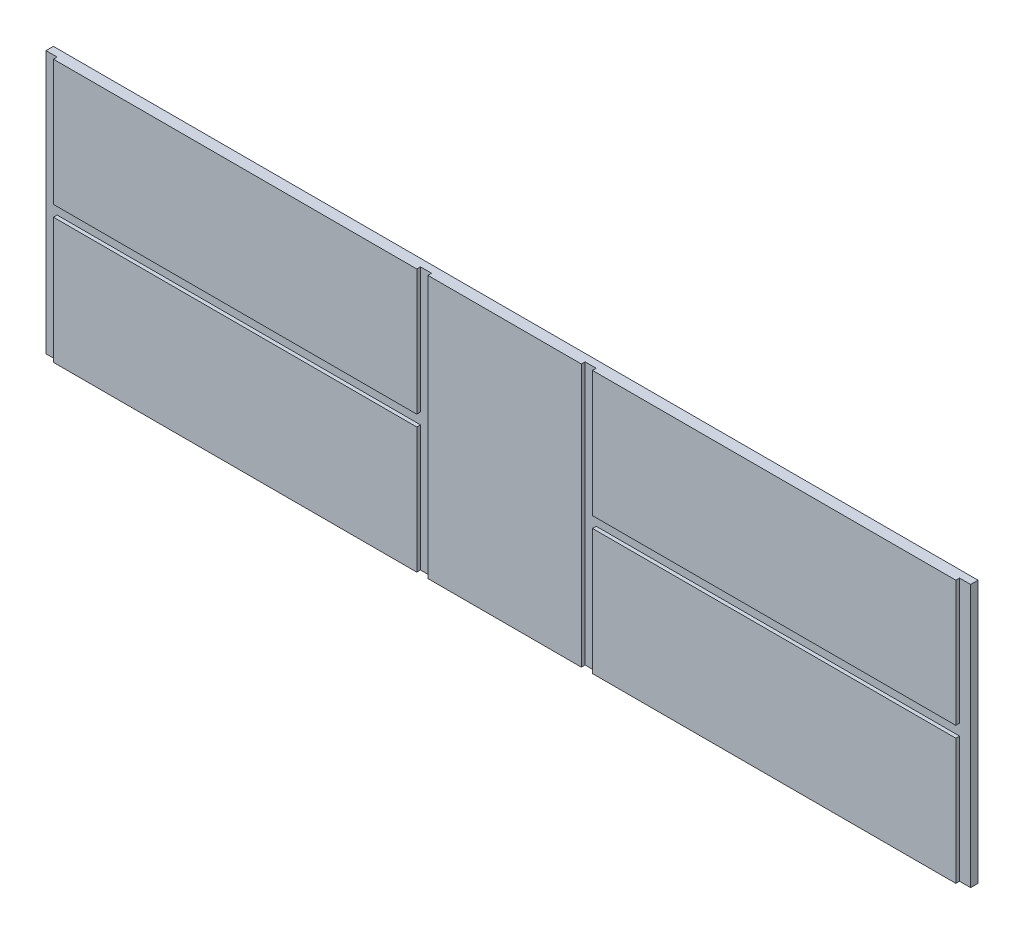
ISO-10303-21;
HEADER;
FILE_DESCRIPTION(('STEP AP214'),'2;1');
FILE_NAME('part.step','',(''),(''),'','','');
FILE_SCHEMA(('AUTOMOTIVE_DESIGN { 1 0 10303 214 1 1 1 1 }'));
ENDSEC;
DATA;
#1=APPLICATION_CONTEXT('core data for automotive mechanical design processes');
#2=APPLICATION_PROTOCOL_DEFINITION('international standard','automotive_design',2000,#1);
#3=PRODUCT_CONTEXT('',#1,'mechanical');
#4=PRODUCT('Part','Part','',(#3));
#5=PRODUCT_RELATED_PRODUCT_CATEGORY('part','',(#4));
#6=PRODUCT_DEFINITION_FORMATION('','',#4);
#7=PRODUCT_DEFINITION_CONTEXT('part definition',#1,'design');
#8=PRODUCT_DEFINITION('design','',#6,#7);
#9=PRODUCT_DEFINITION_SHAPE('','',#8);
#10=(LENGTH_UNIT() NAMED_UNIT(*) SI_UNIT(.MILLI.,.METRE.));
#11=(NAMED_UNIT(*) PLANE_ANGLE_UNIT() SI_UNIT($,.RADIAN.));
#12=(NAMED_UNIT(*) SI_UNIT($,.STERADIAN.) SOLID_ANGLE_UNIT());
#13=UNCERTAINTY_MEASURE_WITH_UNIT(LENGTH_MEASURE(1.E-05),#10,'distance_accuracy_value','');
#14=(GEOMETRIC_REPRESENTATION_CONTEXT(3) GLOBAL_UNCERTAINTY_ASSIGNED_CONTEXT((#13)) GLOBAL_UNIT_ASSIGNED_CONTEXT((#10,
#11,#12)) REPRESENTATION_CONTEXT('',''));
#15=CARTESIAN_POINT('',(0.,0.,0.));
#16=DIRECTION('',(0.,0.,1.));
#17=DIRECTION('',(1.,0.,0.));
#18=AXIS2_PLACEMENT_3D('',#15,#16,#17);
#19=CARTESIAN_POINT('',(0.,0.,12.));
#20=DIRECTION('',(0.,0.,1.));
#21=DIRECTION('',(1.,0.,0.));
#22=AXIS2_PLACEMENT_3D('',#19,#20,#21);
#23=PLANE('',#22);
#24=DIRECTION('',(-1.,0.,0.));
#25=VECTOR('',#24,1.);
#26=CARTESIAN_POINT('',(12.,148.,12.));
#27=LINE('',#26,#25);
#28=CARTESIAN_POINT('',(405.,148.,12.));
#29=VERTEX_POINT('',#28);
#30=CARTESIAN_POINT('',(12.,148.,12.));
#31=VERTEX_POINT('',#30);
#32=EDGE_CURVE('E201',#29,#31,#27,.T.);
#33=ORIENTED_EDGE('',*,*,#32,.F.);
#34=DIRECTION('',(0.,-1.,0.));
#35=VECTOR('',#34,1.);
#36=CARTESIAN_POINT('',(405.,284.,12.));
#37=LINE('',#36,#35);
#38=CARTESIAN_POINT('',(405.,284.,12.));
#39=VERTEX_POINT('',#38);
#40=EDGE_CURVE('E294',#39,#29,#37,.T.);
#41=ORIENTED_EDGE('',*,*,#40,.F.);
#42=DIRECTION('',(1.,0.,0.));
#43=VECTOR('',#42,1.);
#44=CARTESIAN_POINT('',(0.,284.,12.));
#45=LINE('',#44,#43);
#46=CARTESIAN_POINT('',(12.,284.,12.));
#47=VERTEX_POINT('',#46);
#48=EDGE_CURVE('E318',#47,#39,#45,.T.);
#49=ORIENTED_EDGE('',*,*,#48,.F.);
#50=DIRECTION('',(0.,1.,0.));
#51=VECTOR('',#50,1.);
#52=CARTESIAN_POINT('',(12.,284.,12.));
#53=LINE('',#52,#51);
#54=EDGE_CURVE('E225',#31,#47,#53,.T.);
#55=ORIENTED_EDGE('',*,*,#54,.F.);
#56=EDGE_LOOP('',(#33,#41,#49,#55));
#57=FACE_BOUND('',#56,.T.);
#58=ADVANCED_FACE('F33',(#57),#23,.T.);
#59=DIRECTION('',(-1.,0.,0.));
#60=VECTOR('',#59,1.);
#61=CARTESIAN_POINT('',(595.,148.,12.));
#62=LINE('',#61,#60);
#63=CARTESIAN_POINT('',(988.,148.,12.));
#64=VERTEX_POINT('',#63);
#65=CARTESIAN_POINT('',(595.,148.,12.));
#66=VERTEX_POINT('',#65);
#67=EDGE_CURVE('E395',#64,#66,#62,.T.);
#68=ORIENTED_EDGE('',*,*,#67,.F.);
#69=DIRECTION('',(0.,-1.,0.));
#70=VECTOR('',#69,1.);
#71=CARTESIAN_POINT('',(988.,284.,12.));
#72=LINE('',#71,#70);
#73=CARTESIAN_POINT('',(988.,284.,12.));
#74=VERTEX_POINT('',#73);
#75=EDGE_CURVE('E265',#74,#64,#72,.T.);
#76=ORIENTED_EDGE('',*,*,#75,.F.);
#77=CARTESIAN_POINT('',(595.,284.,12.));
#78=VERTEX_POINT('',#77);
#79=EDGE_CURVE('E314',#78,#74,#45,.T.);
#80=ORIENTED_EDGE('',*,*,#79,.F.);
#81=DIRECTION('',(0.,1.,0.));
#82=VECTOR('',#81,1.);
#83=CARTESIAN_POINT('',(595.,284.,12.));
#84=LINE('',#83,#82);
#85=EDGE_CURVE('E248',#66,#78,#84,.T.);
#86=ORIENTED_EDGE('',*,*,#85,.F.);
#87=EDGE_LOOP('',(#68,#76,#80,#86));
#88=FACE_BOUND('',#87,.T.);
#89=ADVANCED_FACE('F394',(#88),#23,.T.);
#90=CARTESIAN_POINT('',(988.,284.,8.));
#91=DIRECTION('',(-1.,0.,0.));
#92=DIRECTION('',(0.,0.,1.));
#93=AXIS2_PLACEMENT_3D('',#90,#91,#92);
#94=PLANE('',#93);
#95=ORIENTED_EDGE('',*,*,#75,.T.);
#96=DIRECTION('',(0.,0.,1.));
#97=VECTOR('',#96,1.);
#98=CARTESIAN_POINT('',(988.,148.,8.));
#99=LINE('',#98,#97);
#100=CARTESIAN_POINT('',(988.,148.,8.));
#101=VERTEX_POINT('',#100);
#102=EDGE_CURVE('E399',#101,#64,#99,.T.);
#103=ORIENTED_EDGE('',*,*,#102,.F.);
#104=DIRECTION('',(0.,-1.,0.));
#105=VECTOR('',#104,1.);
#106=CARTESIAN_POINT('',(988.,284.,8.));
#107=LINE('',#106,#105);
#108=CARTESIAN_POINT('',(988.,284.,8.));
#109=VERTEX_POINT('',#108);
#110=EDGE_CURVE('E269',#109,#101,#107,.T.);
#111=ORIENTED_EDGE('',*,*,#110,.F.);
#112=DIRECTION('',(0.,0.,1.));
#113=VECTOR('',#112,1.);
#114=CARTESIAN_POINT('',(988.,284.,8.));
#115=LINE('',#114,#113);
#116=EDGE_CURVE('E273',#109,#74,#115,.T.);
#117=ORIENTED_EDGE('',*,*,#116,.T.);
#118=EDGE_LOOP('',(#95,#103,#111,#117));
#119=FACE_BOUND('',#118,.T.);
#120=ADVANCED_FACE('F398',(#119),#94,.F.);
#121=CARTESIAN_POINT('',(405.,284.,8.));
#122=DIRECTION('',(-1.,0.,0.));
#123=DIRECTION('',(0.,-1.,0.));
#124=AXIS2_PLACEMENT_3D('',#121,#122,#123);
#125=PLANE('',#124);
#126=ORIENTED_EDGE('',*,*,#40,.T.);
#127=DIRECTION('',(0.,0.,1.));
#128=VECTOR('',#127,1.);
#129=CARTESIAN_POINT('',(405.,148.,8.));
#130=LINE('',#129,#128);
#131=CARTESIAN_POINT('',(405.,148.,8.));
#132=VERTEX_POINT('',#131);
#133=EDGE_CURVE('E419',#132,#29,#130,.T.);
#134=ORIENTED_EDGE('',*,*,#133,.F.);
#135=DIRECTION('',(0.,-1.,0.));
#136=VECTOR('',#135,1.);
#137=CARTESIAN_POINT('',(405.,284.,8.));
#138=LINE('',#137,#136);
#139=CARTESIAN_POINT('',(405.,284.,8.));
#140=VERTEX_POINT('',#139);
#141=EDGE_CURVE('E281',#140,#132,#138,.T.);
#142=ORIENTED_EDGE('',*,*,#141,.F.);
#143=DIRECTION('',(0.,0.,1.));
#144=VECTOR('',#143,1.);
#145=CARTESIAN_POINT('',(405.,284.,8.));
#146=LINE('',#145,#144);
#147=EDGE_CURVE('E299',#140,#39,#146,.T.);
#148=ORIENTED_EDGE('',*,*,#147,.T.);
#149=EDGE_LOOP('',(#126,#134,#142,#148));
#150=FACE_BOUND('',#149,.T.);
#151=ADVANCED_FACE('F434',(#150),#125,.F.);
#152=CARTESIAN_POINT('',(595.,284.,8.));
#153=DIRECTION('',(1.,0.,0.));
#154=DIRECTION('',(0.,0.,-1.));
#155=AXIS2_PLACEMENT_3D('',#152,#153,#154);
#156=PLANE('',#155);
#157=DIRECTION('',(0.,1.,0.));
#158=VECTOR('',#157,1.);
#159=CARTESIAN_POINT('',(595.,284.,8.));
#160=LINE('',#159,#158);
#161=CARTESIAN_POINT('',(595.,148.,8.));
#162=VERTEX_POINT('',#161);
#163=CARTESIAN_POINT('',(595.,284.,8.));
#164=VERTEX_POINT('',#163);
#165=EDGE_CURVE('E238',#162,#164,#160,.T.);
#166=ORIENTED_EDGE('',*,*,#165,.F.);
#167=DIRECTION('',(0.,0.,1.));
#168=VECTOR('',#167,1.);
#169=CARTESIAN_POINT('',(595.,148.,8.));
#170=LINE('',#169,#168);
#171=EDGE_CURVE('E408',#162,#66,#170,.T.);
#172=ORIENTED_EDGE('',*,*,#171,.T.);
#173=ORIENTED_EDGE('',*,*,#85,.T.);
#174=DIRECTION('',(0.,0.,1.));
#175=VECTOR('',#174,1.);
#176=CARTESIAN_POINT('',(595.,284.,8.));
#177=LINE('',#176,#175);
#178=EDGE_CURVE('E255',#164,#78,#177,.T.);
#179=ORIENTED_EDGE('',*,*,#178,.F.);
#180=EDGE_LOOP('',(#166,#172,#173,#179));
#181=FACE_BOUND('',#180,.T.);
#182=ADVANCED_FACE('F476',(#181),#156,.F.);
#183=CARTESIAN_POINT('',(12.,284.,8.));
#184=DIRECTION('',(1.,0.,0.));
#185=DIRECTION('',(0.,1.,0.));
#186=AXIS2_PLACEMENT_3D('',#183,#184,#185);
#187=PLANE('',#186);
#188=DIRECTION('',(0.,1.,0.));
#189=VECTOR('',#188,1.);
#190=CARTESIAN_POINT('',(12.,284.,8.));
#191=LINE('',#190,#189);
#192=CARTESIAN_POINT('',(12.,148.,8.));
#193=VERTEX_POINT('',#192);
#194=CARTESIAN_POINT('',(12.,284.,8.));
#195=VERTEX_POINT('',#194);
#196=EDGE_CURVE('E216',#193,#195,#191,.T.);
#197=ORIENTED_EDGE('',*,*,#196,.F.);
#198=DIRECTION('',(0.,0.,1.));
#199=VECTOR('',#198,1.);
#200=CARTESIAN_POINT('',(12.,148.,8.));
#201=LINE('',#200,#199);
#202=EDGE_CURVE('E249',#193,#31,#201,.T.);
#203=ORIENTED_EDGE('',*,*,#202,.T.);
#204=ORIENTED_EDGE('',*,*,#54,.T.);
#205=DIRECTION('',(0.,0.,1.));
#206=VECTOR('',#205,1.);
#207=CARTESIAN_POINT('',(12.,284.,8.));
#208=LINE('',#207,#206);
#209=EDGE_CURVE('E226',#195,#47,#208,.T.);
#210=ORIENTED_EDGE('',*,*,#209,.F.);
#211=EDGE_LOOP('',(#197,#203,#204,#210));
#212=FACE_BOUND('',#211,.T.);
#213=ADVANCED_FACE('F359',(#212),#187,.F.);
#214=CARTESIAN_POINT('',(0.,0.,12.));
#215=DIRECTION('',(-1.,0.,0.));
#216=DIRECTION('',(0.,0.,1.));
#217=AXIS2_PLACEMENT_3D('',#214,#215,#216);
#218=PLANE('',#217);
#219=DIRECTION('',(0.,0.,-1.));
#220=VECTOR('',#219,1.);
#221=CARTESIAN_POINT('',(0.,0.,12.));
#222=LINE('',#221,#220);
#223=CARTESIAN_POINT('',(0.,0.,8.));
#224=VERTEX_POINT('',#223);
#225=CARTESIAN_POINT('',(0.,0.,0.));
#226=VERTEX_POINT('',#225);
#227=EDGE_CURVE('E329',#224,#226,#222,.T.);
#228=ORIENTED_EDGE('',*,*,#227,.F.);
#229=DIRECTION('',(0.,-1.,0.));
#230=VECTOR('',#229,1.);
#231=CARTESIAN_POINT('',(0.,284.,8.));
#232=LINE('',#231,#230);
#233=CARTESIAN_POINT('',(0.,284.,8.));
#234=VERTEX_POINT('',#233);
#235=EDGE_CURVE('E224',#234,#224,#232,.T.);
#236=ORIENTED_EDGE('',*,*,#235,.F.);
#237=DIRECTION('',(0.,0.,-1.));
#238=VECTOR('',#237,1.);
#239=CARTESIAN_POINT('',(0.,284.,12.));
#240=LINE('',#239,#238);
#241=CARTESIAN_POINT('',(0.,284.,0.));
#242=VERTEX_POINT('',#241);
#243=EDGE_CURVE('E331',#234,#242,#240,.T.);
#244=ORIENTED_EDGE('',*,*,#243,.T.);
#245=DIRECTION('',(0.,1.,0.));
#246=VECTOR('',#245,1.);
#247=CARTESIAN_POINT('',(0.,0.,0.));
#248=LINE('',#247,#246);
#249=EDGE_CURVE('E312',#226,#242,#248,.T.);
#250=ORIENTED_EDGE('',*,*,#249,.F.);
#251=EDGE_LOOP('',(#228,#236,#244,#250));
#252=FACE_BOUND('',#251,.T.);
#253=ADVANCED_FACE('F350',(#252),#218,.T.);
#254=DIRECTION('',(0.,-1.,0.));
#255=VECTOR('',#254,1.);
#256=CARTESIAN_POINT('',(583.,284.,12.));
#257=LINE('',#256,#255);
#258=CARTESIAN_POINT('',(583.,284.,12.));
#259=VERTEX_POINT('',#258);
#260=CARTESIAN_POINT('',(583.,0.,12.));
#261=VERTEX_POINT('',#260);
#262=EDGE_CURVE('E246',#259,#261,#257,.T.);
#263=ORIENTED_EDGE('',*,*,#262,.F.);
#264=CARTESIAN_POINT('',(417.,284.,12.));
#265=VERTEX_POINT('',#264);
#266=EDGE_CURVE('E317',#265,#259,#45,.T.);
#267=ORIENTED_EDGE('',*,*,#266,.F.);
#268=DIRECTION('',(0.,1.,0.));
#269=VECTOR('',#268,1.);
#270=CARTESIAN_POINT('',(417.,284.,12.));
#271=LINE('',#270,#269);
#272=CARTESIAN_POINT('',(417.,0.,12.));
#273=VERTEX_POINT('',#272);
#274=EDGE_CURVE('E297',#273,#265,#271,.T.);
#275=ORIENTED_EDGE('',*,*,#274,.F.);
#276=DIRECTION('',(1.,0.,0.));
#277=VECTOR('',#276,1.);
#278=CARTESIAN_POINT('',(0.,0.,12.));
#279=LINE('',#278,#277);
#280=EDGE_CURVE('E311',#273,#261,#279,.T.);
#281=ORIENTED_EDGE('',*,*,#280,.T.);
#282=EDGE_LOOP('',(#263,#267,#275,#281));
#283=FACE_BOUND('',#282,.T.);
#284=ADVANCED_FACE('F373',(#283),#23,.T.);
#285=DIRECTION('',(1.,0.,0.));
#286=VECTOR('',#285,1.);
#287=CARTESIAN_POINT('',(12.,136.,12.));
#288=LINE('',#287,#286);
#289=CARTESIAN_POINT('',(12.,136.,12.));
#290=VERTEX_POINT('',#289);
#291=CARTESIAN_POINT('',(405.,136.,12.));
#292=VERTEX_POINT('',#291);
#293=EDGE_CURVE('E411',#290,#292,#288,.T.);
#294=ORIENTED_EDGE('',*,*,#293,.F.);
#295=CARTESIAN_POINT('',(12.,0.,12.));
#296=VERTEX_POINT('',#295);
#297=EDGE_CURVE('E209',#296,#290,#53,.T.);
#298=ORIENTED_EDGE('',*,*,#297,.F.);
#299=CARTESIAN_POINT('',(405.,0.,12.));
#300=VERTEX_POINT('',#299);
#301=EDGE_CURVE('E313',#296,#300,#279,.T.);
#302=ORIENTED_EDGE('',*,*,#301,.T.);
#303=EDGE_CURVE('E254',#292,#300,#37,.T.);
#304=ORIENTED_EDGE('',*,*,#303,.F.);
#305=EDGE_LOOP('',(#294,#298,#302,#304));
#306=FACE_BOUND('',#305,.T.);
#307=ADVANCED_FACE('F430',(#306),#23,.T.);
#308=CARTESIAN_POINT('',(0.,0.,12.));
#309=DIRECTION('',(0.,1.,0.));
#310=DIRECTION('',(0.,0.,1.));
#311=AXIS2_PLACEMENT_3D('',#308,#309,#310);
#312=PLANE('',#311);
#313=ORIENTED_EDGE('',*,*,#301,.F.);
#314=DIRECTION('',(0.,0.,1.));
#315=VECTOR('',#314,1.);
#316=CARTESIAN_POINT('',(12.,0.,8.));
#317=LINE('',#316,#315);
#318=CARTESIAN_POINT('',(12.,0.,8.));
#319=VERTEX_POINT('',#318);
#320=EDGE_CURVE('E218',#319,#296,#317,.T.);
#321=ORIENTED_EDGE('',*,*,#320,.F.);
#322=DIRECTION('',(1.,0.,0.));
#323=VECTOR('',#322,1.);
#324=CARTESIAN_POINT('',(0.,0.,8.));
#325=LINE('',#324,#323);
#326=EDGE_CURVE('E213',#224,#319,#325,.T.);
#327=ORIENTED_EDGE('',*,*,#326,.F.);
#328=ORIENTED_EDGE('',*,*,#227,.T.);
#329=DIRECTION('',(1.,0.,0.));
#330=VECTOR('',#329,1.);
#331=CARTESIAN_POINT('',(0.,0.,0.));
#332=LINE('',#331,#330);
#333=CARTESIAN_POINT('',(1000.,0.,0.));
#334=VERTEX_POINT('',#333);
#335=EDGE_CURVE('E229',#226,#334,#332,.T.);
#336=ORIENTED_EDGE('',*,*,#335,.T.);
#337=DIRECTION('',(0.,0.,-1.));
#338=VECTOR('',#337,1.);
#339=CARTESIAN_POINT('',(1000.,0.,12.));
#340=LINE('',#339,#338);
#341=CARTESIAN_POINT('',(1000.,0.,8.));
#342=VERTEX_POINT('',#341);
#343=EDGE_CURVE('E11',#342,#334,#340,.T.);
#344=ORIENTED_EDGE('',*,*,#343,.F.);
#345=DIRECTION('',(1.,0.,0.));
#346=VECTOR('',#345,1.);
#347=CARTESIAN_POINT('',(1000.,0.,8.));
#348=LINE('',#347,#346);
#349=CARTESIAN_POINT('',(988.,0.,8.));
#350=VERTEX_POINT('',#349);
#351=EDGE_CURVE('E271',#350,#342,#348,.T.);
#352=ORIENTED_EDGE('',*,*,#351,.F.);
#353=DIRECTION('',(0.,0.,1.));
#354=VECTOR('',#353,1.);
#355=CARTESIAN_POINT('',(988.,0.,8.));
#356=LINE('',#355,#354);
#357=CARTESIAN_POINT('',(988.,0.,12.));
#358=VERTEX_POINT('',#357);
#359=EDGE_CURVE('E277',#350,#358,#356,.T.);
#360=ORIENTED_EDGE('',*,*,#359,.T.);
#361=CARTESIAN_POINT('',(595.,0.,12.));
#362=VERTEX_POINT('',#361);
#363=EDGE_CURVE('E308',#362,#358,#279,.T.);
#364=ORIENTED_EDGE('',*,*,#363,.F.);
#365=DIRECTION('',(0.,0.,1.));
#366=VECTOR('',#365,1.);
#367=CARTESIAN_POINT('',(595.,0.,8.));
#368=LINE('',#367,#366);
#369=CARTESIAN_POINT('',(595.,0.,8.));
#370=VERTEX_POINT('',#369);
#371=EDGE_CURVE('E258',#370,#362,#368,.T.);
#372=ORIENTED_EDGE('',*,*,#371,.F.);
#373=DIRECTION('',(1.,0.,0.));
#374=VECTOR('',#373,1.);
#375=CARTESIAN_POINT('',(583.,0.,8.));
#376=LINE('',#375,#374);
#377=CARTESIAN_POINT('',(583.,0.,8.));
#378=VERTEX_POINT('',#377);
#379=EDGE_CURVE('E234',#378,#370,#376,.T.);
#380=ORIENTED_EDGE('',*,*,#379,.F.);
#381=DIRECTION('',(0.,0.,1.));
#382=VECTOR('',#381,1.);
#383=CARTESIAN_POINT('',(583.,0.,8.));
#384=LINE('',#383,#382);
#385=EDGE_CURVE('E245',#378,#261,#384,.T.);
#386=ORIENTED_EDGE('',*,*,#385,.T.);
#387=ORIENTED_EDGE('',*,*,#280,.F.);
#388=DIRECTION('',(0.,0.,1.));
#389=VECTOR('',#388,1.);
#390=CARTESIAN_POINT('',(417.,0.,8.));
#391=LINE('',#390,#389);
#392=CARTESIAN_POINT('',(417.,0.,8.));
#393=VERTEX_POINT('',#392);
#394=EDGE_CURVE('E304',#393,#273,#391,.T.);
#395=ORIENTED_EDGE('',*,*,#394,.F.);
#396=DIRECTION('',(1.,0.,0.));
#397=VECTOR('',#396,1.);
#398=CARTESIAN_POINT('',(405.,0.,8.));
#399=LINE('',#398,#397);
#400=CARTESIAN_POINT('',(405.,0.,8.));
#401=VERTEX_POINT('',#400);
#402=EDGE_CURVE('E283',#401,#393,#399,.T.);
#403=ORIENTED_EDGE('',*,*,#402,.F.);
#404=DIRECTION('',(0.,0.,1.));
#405=VECTOR('',#404,1.);
#406=CARTESIAN_POINT('',(405.,0.,8.));
#407=LINE('',#406,#405);
#408=EDGE_CURVE('E293',#401,#300,#407,.T.);
#409=ORIENTED_EDGE('',*,*,#408,.T.);
#410=EDGE_LOOP('',(#313,#321,#327,#328,#336,#344,#352,#360,#364,#372,#380,#386,#387,#395,#403,#409));
#411=FACE_BOUND('',#410,.T.);
#412=ADVANCED_FACE('F35',(#411),#312,.F.);
#413=CARTESIAN_POINT('',(1000.,0.,12.));
#414=DIRECTION('',(-1.,0.,0.));
#415=DIRECTION('',(0.,0.,1.));
#416=AXIS2_PLACEMENT_3D('',#413,#414,#415);
#417=PLANE('',#416);
#418=DIRECTION('',(0.,0.,-1.));
#419=VECTOR('',#418,1.);
#420=CARTESIAN_POINT('',(1000.,284.,12.));
#421=LINE('',#420,#419);
#422=CARTESIAN_POINT('',(1000.,284.,8.));
#423=VERTEX_POINT('',#422);
#424=CARTESIAN_POINT('',(1000.,284.,0.));
#425=VERTEX_POINT('',#424);
#426=EDGE_CURVE('E41',#423,#425,#421,.T.);
#427=ORIENTED_EDGE('',*,*,#426,.F.);
#428=DIRECTION('',(0.,1.,0.));
#429=VECTOR('',#428,1.);
#430=CARTESIAN_POINT('',(1000.,284.,8.));
#431=LINE('',#430,#429);
#432=EDGE_CURVE('E262',#342,#423,#431,.T.);
#433=ORIENTED_EDGE('',*,*,#432,.F.);
#434=ORIENTED_EDGE('',*,*,#343,.T.);
#435=DIRECTION('',(0.,1.,0.));
#436=VECTOR('',#435,1.);
#437=CARTESIAN_POINT('',(1000.,0.,0.));
#438=LINE('',#437,#436);
#439=EDGE_CURVE('E321',#334,#425,#438,.T.);
#440=ORIENTED_EDGE('',*,*,#439,.T.);
#441=EDGE_LOOP('',(#427,#433,#434,#440));
#442=FACE_BOUND('',#441,.T.);
#443=ADVANCED_FACE('F342',(#442),#417,.F.);
#444=CARTESIAN_POINT('',(0.,284.,12.));
#445=DIRECTION('',(0.,1.,0.));
#446=DIRECTION('',(0.,0.,1.));
#447=AXIS2_PLACEMENT_3D('',#444,#445,#446);
#448=PLANE('',#447);
#449=ORIENTED_EDGE('',*,*,#209,.T.);
#450=ORIENTED_EDGE('',*,*,#48,.T.);
#451=ORIENTED_EDGE('',*,*,#147,.F.);
#452=DIRECTION('',(-1.,0.,0.));
#453=VECTOR('',#452,1.);
#454=CARTESIAN_POINT('',(405.,284.,8.));
#455=LINE('',#454,#453);
#456=CARTESIAN_POINT('',(417.,284.,8.));
#457=VERTEX_POINT('',#456);
#458=EDGE_CURVE('E290',#457,#140,#455,.T.);
#459=ORIENTED_EDGE('',*,*,#458,.F.);
#460=DIRECTION('',(0.,0.,1.));
#461=VECTOR('',#460,1.);
#462=CARTESIAN_POINT('',(417.,284.,8.));
#463=LINE('',#462,#461);
#464=EDGE_CURVE('E301',#457,#265,#463,.T.);
#465=ORIENTED_EDGE('',*,*,#464,.T.);
#466=ORIENTED_EDGE('',*,*,#266,.T.);
#467=DIRECTION('',(0.,0.,1.));
#468=VECTOR('',#467,1.);
#469=CARTESIAN_POINT('',(583.,284.,8.));
#470=LINE('',#469,#468);
#471=CARTESIAN_POINT('',(583.,284.,8.));
#472=VERTEX_POINT('',#471);
#473=EDGE_CURVE('E252',#472,#259,#470,.T.);
#474=ORIENTED_EDGE('',*,*,#473,.F.);
#475=DIRECTION('',(-1.,0.,0.));
#476=VECTOR('',#475,1.);
#477=CARTESIAN_POINT('',(583.,284.,8.));
#478=LINE('',#477,#476);
#479=EDGE_CURVE('E242',#164,#472,#478,.T.);
#480=ORIENTED_EDGE('',*,*,#479,.F.);
#481=ORIENTED_EDGE('',*,*,#178,.T.);
#482=ORIENTED_EDGE('',*,*,#79,.T.);
#483=ORIENTED_EDGE('',*,*,#116,.F.);
#484=DIRECTION('',(-1.,0.,0.));
#485=VECTOR('',#484,1.);
#486=CARTESIAN_POINT('',(1000.,284.,8.));
#487=LINE('',#486,#485);
#488=EDGE_CURVE('E264',#423,#109,#487,.T.);
#489=ORIENTED_EDGE('',*,*,#488,.F.);
#490=ORIENTED_EDGE('',*,*,#426,.T.);
#491=DIRECTION('',(1.,0.,0.));
#492=VECTOR('',#491,1.);
#493=CARTESIAN_POINT('',(0.,284.,0.));
#494=LINE('',#493,#492);
#495=EDGE_CURVE('E324',#242,#425,#494,.T.);
#496=ORIENTED_EDGE('',*,*,#495,.F.);
#497=ORIENTED_EDGE('',*,*,#243,.F.);
#498=DIRECTION('',(-1.,0.,0.));
#499=VECTOR('',#498,1.);
#500=CARTESIAN_POINT('',(0.,284.,8.));
#501=LINE('',#500,#499);
#502=EDGE_CURVE('E215',#195,#234,#501,.T.);
#503=ORIENTED_EDGE('',*,*,#502,.F.);
#504=EDGE_LOOP('',(#449,#450,#451,#459,#465,#466,#474,#480,#481,#482,#483,#489,#490,#496,#497,#503));
#505=FACE_BOUND('',#504,.T.);
#506=ADVANCED_FACE('F336',(#505),#448,.T.);
#507=DIRECTION('',(1.,0.,0.));
#508=VECTOR('',#507,1.);
#509=CARTESIAN_POINT('',(595.,136.,12.));
#510=LINE('',#509,#508);
#511=CARTESIAN_POINT('',(595.,136.,12.));
#512=VERTEX_POINT('',#511);
#513=CARTESIAN_POINT('',(988.,136.,12.));
#514=VERTEX_POINT('',#513);
#515=EDGE_CURVE('E414',#512,#514,#510,.T.);
#516=ORIENTED_EDGE('',*,*,#515,.F.);
#517=EDGE_CURVE('E235',#362,#512,#84,.T.);
#518=ORIENTED_EDGE('',*,*,#517,.F.);
#519=ORIENTED_EDGE('',*,*,#363,.T.);
#520=EDGE_CURVE('E276',#514,#358,#72,.T.);
#521=ORIENTED_EDGE('',*,*,#520,.F.);
#522=EDGE_LOOP('',(#516,#518,#519,#521));
#523=FACE_BOUND('',#522,.T.);
#524=ADVANCED_FACE('F449',(#523),#23,.T.);
#525=CARTESIAN_POINT('',(0.,0.,0.));
#526=DIRECTION('',(0.,0.,1.));
#527=DIRECTION('',(1.,0.,0.));
#528=AXIS2_PLACEMENT_3D('',#525,#526,#527);
#529=PLANE('',#528);
#530=ORIENTED_EDGE('',*,*,#335,.F.);
#531=ORIENTED_EDGE('',*,*,#249,.T.);
#532=ORIENTED_EDGE('',*,*,#495,.T.);
#533=ORIENTED_EDGE('',*,*,#439,.F.);
#534=EDGE_LOOP('',(#530,#531,#532,#533));
#535=FACE_BOUND('',#534,.T.);
#536=ADVANCED_FACE('F346',(#535),#529,.F.);
#537=CARTESIAN_POINT('',(988.,136.,8.));
#538=VERTEX_POINT('',#537);
#539=EDGE_CURVE('E268',#538,#350,#107,.T.);
#540=ORIENTED_EDGE('',*,*,#539,.F.);
#541=DIRECTION('',(0.,0.,1.));
#542=VECTOR('',#541,1.);
#543=CARTESIAN_POINT('',(988.,136.,8.));
#544=LINE('',#543,#542);
#545=EDGE_CURVE('E404',#538,#514,#544,.T.);
#546=ORIENTED_EDGE('',*,*,#545,.T.);
#547=ORIENTED_EDGE('',*,*,#520,.T.);
#548=ORIENTED_EDGE('',*,*,#359,.F.);
#549=EDGE_LOOP('',(#540,#546,#547,#548));
#550=FACE_BOUND('',#549,.T.);
#551=ADVANCED_FACE('F461',(#550),#94,.F.);
#552=CARTESIAN_POINT('',(405.,136.,8.));
#553=VERTEX_POINT('',#552);
#554=EDGE_CURVE('E284',#553,#401,#138,.T.);
#555=ORIENTED_EDGE('',*,*,#554,.F.);
#556=DIRECTION('',(0.,0.,1.));
#557=VECTOR('',#556,1.);
#558=CARTESIAN_POINT('',(405.,136.,8.));
#559=LINE('',#558,#557);
#560=EDGE_CURVE('E198',#553,#292,#559,.T.);
#561=ORIENTED_EDGE('',*,*,#560,.T.);
#562=ORIENTED_EDGE('',*,*,#303,.T.);
#563=ORIENTED_EDGE('',*,*,#408,.F.);
#564=EDGE_LOOP('',(#555,#561,#562,#563));
#565=FACE_BOUND('',#564,.T.);
#566=ADVANCED_FACE('F427',(#565),#125,.F.);
#567=CARTESIAN_POINT('',(417.,284.,8.));
#568=DIRECTION('',(1.,0.,0.));
#569=DIRECTION('',(0.,1.,0.));
#570=AXIS2_PLACEMENT_3D('',#567,#568,#569);
#571=PLANE('',#570);
#572=ORIENTED_EDGE('',*,*,#274,.T.);
#573=ORIENTED_EDGE('',*,*,#464,.F.);
#574=DIRECTION('',(0.,1.,0.));
#575=VECTOR('',#574,1.);
#576=CARTESIAN_POINT('',(417.,284.,8.));
#577=LINE('',#576,#575);
#578=EDGE_CURVE('E287',#393,#457,#577,.T.);
#579=ORIENTED_EDGE('',*,*,#578,.F.);
#580=ORIENTED_EDGE('',*,*,#394,.T.);
#581=EDGE_LOOP('',(#572,#573,#579,#580));
#582=FACE_BOUND('',#581,.T.);
#583=ADVANCED_FACE('F493',(#582),#571,.F.);
#584=CARTESIAN_POINT('',(583.,284.,8.));
#585=DIRECTION('',(-1.,0.,0.));
#586=DIRECTION('',(0.,0.,1.));
#587=AXIS2_PLACEMENT_3D('',#584,#585,#586);
#588=PLANE('',#587);
#589=ORIENTED_EDGE('',*,*,#262,.T.);
#590=ORIENTED_EDGE('',*,*,#385,.F.);
#591=DIRECTION('',(0.,-1.,0.));
#592=VECTOR('',#591,1.);
#593=CARTESIAN_POINT('',(583.,284.,8.));
#594=LINE('',#593,#592);
#595=EDGE_CURVE('E231',#472,#378,#594,.T.);
#596=ORIENTED_EDGE('',*,*,#595,.F.);
#597=ORIENTED_EDGE('',*,*,#473,.T.);
#598=EDGE_LOOP('',(#589,#590,#596,#597));
#599=FACE_BOUND('',#598,.T.);
#600=ADVANCED_FACE('F377',(#599),#588,.F.);
#601=ORIENTED_EDGE('',*,*,#517,.T.);
#602=DIRECTION('',(0.,0.,1.));
#603=VECTOR('',#602,1.);
#604=CARTESIAN_POINT('',(595.,136.,8.));
#605=LINE('',#604,#603);
#606=CARTESIAN_POINT('',(595.,136.,8.));
#607=VERTEX_POINT('',#606);
#608=EDGE_CURVE('E402',#607,#512,#605,.T.);
#609=ORIENTED_EDGE('',*,*,#608,.F.);
#610=EDGE_CURVE('E239',#370,#607,#160,.T.);
#611=ORIENTED_EDGE('',*,*,#610,.F.);
#612=ORIENTED_EDGE('',*,*,#371,.T.);
#613=EDGE_LOOP('',(#601,#609,#611,#612));
#614=FACE_BOUND('',#613,.T.);
#615=ADVANCED_FACE('F507',(#614),#156,.F.);
#616=CARTESIAN_POINT('',(0.,0.,8.));
#617=DIRECTION('',(0.,0.,1.));
#618=DIRECTION('',(1.,0.,0.));
#619=AXIS2_PLACEMENT_3D('',#616,#617,#618);
#620=PLANE('',#619);
#621=ORIENTED_EDGE('',*,*,#595,.T.);
#622=ORIENTED_EDGE('',*,*,#379,.T.);
#623=ORIENTED_EDGE('',*,*,#610,.T.);
#624=DIRECTION('',(1.,0.,0.));
#625=VECTOR('',#624,1.);
#626=CARTESIAN_POINT('',(595.,136.,8.));
#627=LINE('',#626,#625);
#628=EDGE_CURVE('E413',#607,#538,#627,.T.);
#629=ORIENTED_EDGE('',*,*,#628,.T.);
#630=ORIENTED_EDGE('',*,*,#539,.T.);
#631=ORIENTED_EDGE('',*,*,#351,.T.);
#632=ORIENTED_EDGE('',*,*,#432,.T.);
#633=ORIENTED_EDGE('',*,*,#488,.T.);
#634=ORIENTED_EDGE('',*,*,#110,.T.);
#635=DIRECTION('',(-1.,0.,0.));
#636=VECTOR('',#635,1.);
#637=CARTESIAN_POINT('',(595.,148.,8.));
#638=LINE('',#637,#636);
#639=EDGE_CURVE('E48',#101,#162,#638,.T.);
#640=ORIENTED_EDGE('',*,*,#639,.T.);
#641=ORIENTED_EDGE('',*,*,#165,.T.);
#642=ORIENTED_EDGE('',*,*,#479,.T.);
#643=EDGE_LOOP('',(#621,#622,#623,#629,#630,#631,#632,#633,#634,#640,#641,#642));
#644=FACE_BOUND('',#643,.T.);
#645=ADVANCED_FACE('F384',(#644),#620,.T.);
#646=ORIENTED_EDGE('',*,*,#297,.T.);
#647=DIRECTION('',(0.,0.,1.));
#648=VECTOR('',#647,1.);
#649=CARTESIAN_POINT('',(12.,136.,8.));
#650=LINE('',#649,#648);
#651=CARTESIAN_POINT('',(12.,136.,8.));
#652=VERTEX_POINT('',#651);
#653=EDGE_CURVE('E195',#652,#290,#650,.T.);
#654=ORIENTED_EDGE('',*,*,#653,.F.);
#655=EDGE_CURVE('E206',#319,#652,#191,.T.);
#656=ORIENTED_EDGE('',*,*,#655,.F.);
#657=ORIENTED_EDGE('',*,*,#320,.T.);
#658=EDGE_LOOP('',(#646,#654,#656,#657));
#659=FACE_BOUND('',#658,.T.);
#660=ADVANCED_FACE('F205',(#659),#187,.F.);
#661=CARTESIAN_POINT('',(0.,0.,8.));
#662=DIRECTION('',(0.,0.,1.));
#663=DIRECTION('',(1.,0.,0.));
#664=AXIS2_PLACEMENT_3D('',#661,#662,#663);
#665=PLANE('',#664);
#666=ORIENTED_EDGE('',*,*,#235,.T.);
#667=ORIENTED_EDGE('',*,*,#326,.T.);
#668=ORIENTED_EDGE('',*,*,#655,.T.);
#669=DIRECTION('',(1.,0.,0.));
#670=VECTOR('',#669,1.);
#671=CARTESIAN_POINT('',(12.,136.,8.));
#672=LINE('',#671,#670);
#673=EDGE_CURVE('E192',#652,#553,#672,.T.);
#674=ORIENTED_EDGE('',*,*,#673,.T.);
#675=ORIENTED_EDGE('',*,*,#554,.T.);
#676=ORIENTED_EDGE('',*,*,#402,.T.);
#677=ORIENTED_EDGE('',*,*,#578,.T.);
#678=ORIENTED_EDGE('',*,*,#458,.T.);
#679=ORIENTED_EDGE('',*,*,#141,.T.);
#680=DIRECTION('',(-1.,0.,0.));
#681=VECTOR('',#680,1.);
#682=CARTESIAN_POINT('',(12.,148.,8.));
#683=LINE('',#682,#681);
#684=EDGE_CURVE('E56',#132,#193,#683,.T.);
#685=ORIENTED_EDGE('',*,*,#684,.T.);
#686=ORIENTED_EDGE('',*,*,#196,.T.);
#687=ORIENTED_EDGE('',*,*,#502,.T.);
#688=EDGE_LOOP('',(#666,#667,#668,#674,#675,#676,#677,#678,#679,#685,#686,#687));
#689=FACE_BOUND('',#688,.T.);
#690=ADVANCED_FACE('F211',(#689),#665,.T.);
#691=CARTESIAN_POINT('',(12.,148.,8.));
#692=DIRECTION('',(0.,1.,0.));
#693=DIRECTION('',(0.,0.,1.));
#694=AXIS2_PLACEMENT_3D('',#691,#692,#693);
#695=PLANE('',#694);
#696=ORIENTED_EDGE('',*,*,#32,.T.);
#697=ORIENTED_EDGE('',*,*,#202,.F.);
#698=ORIENTED_EDGE('',*,*,#684,.F.);
#699=ORIENTED_EDGE('',*,*,#133,.T.);
#700=EDGE_LOOP('',(#696,#697,#698,#699));
#701=FACE_BOUND('',#700,.T.);
#702=ADVANCED_FACE('F437',(#701),#695,.F.);
#703=CARTESIAN_POINT('',(12.,136.,8.));
#704=DIRECTION('',(0.,-1.,0.));
#705=DIRECTION('',(0.,0.,-1.));
#706=AXIS2_PLACEMENT_3D('',#703,#704,#705);
#707=PLANE('',#706);
#708=ORIENTED_EDGE('',*,*,#293,.T.);
#709=ORIENTED_EDGE('',*,*,#560,.F.);
#710=ORIENTED_EDGE('',*,*,#673,.F.);
#711=ORIENTED_EDGE('',*,*,#653,.T.);
#712=EDGE_LOOP('',(#708,#709,#710,#711));
#713=FACE_BOUND('',#712,.T.);
#714=ADVANCED_FACE('F194',(#713),#707,.F.);
#715=CARTESIAN_POINT('',(595.,148.,8.));
#716=DIRECTION('',(0.,1.,0.));
#717=DIRECTION('',(0.,0.,1.));
#718=AXIS2_PLACEMENT_3D('',#715,#716,#717);
#719=PLANE('',#718);
#720=ORIENTED_EDGE('',*,*,#67,.T.);
#721=ORIENTED_EDGE('',*,*,#171,.F.);
#722=ORIENTED_EDGE('',*,*,#639,.F.);
#723=ORIENTED_EDGE('',*,*,#102,.T.);
#724=EDGE_LOOP('',(#720,#721,#722,#723));
#725=FACE_BOUND('',#724,.T.);
#726=ADVANCED_FACE('F444',(#725),#719,.F.);
#727=CARTESIAN_POINT('',(595.,136.,8.));
#728=DIRECTION('',(0.,-1.,0.));
#729=DIRECTION('',(0.,0.,-1.));
#730=AXIS2_PLACEMENT_3D('',#727,#728,#729);
#731=PLANE('',#730);
#732=ORIENTED_EDGE('',*,*,#515,.T.);
#733=ORIENTED_EDGE('',*,*,#545,.F.);
#734=ORIENTED_EDGE('',*,*,#628,.F.);
#735=ORIENTED_EDGE('',*,*,#608,.T.);
#736=EDGE_LOOP('',(#732,#733,#734,#735));
#737=FACE_BOUND('',#736,.T.);
#738=ADVANCED_FACE('F622',(#737),#731,.F.);
#739=CLOSED_SHELL('',(#58,#89,#120,#151,#182,#213,#253,#284,#307,#412,#443,#506,#524,#536,#551,
#566,#583,#600,#615,#645,#660,#690,#702,#714,#726,#738));
#740=MANIFOLD_SOLID_BREP('B2',#739);
#741=ADVANCED_BREP_SHAPE_REPRESENTATION('',(#18,#740),#14);
#742=SHAPE_DEFINITION_REPRESENTATION(#9,#741);
ENDSEC;
END-ISO-10303-21;
